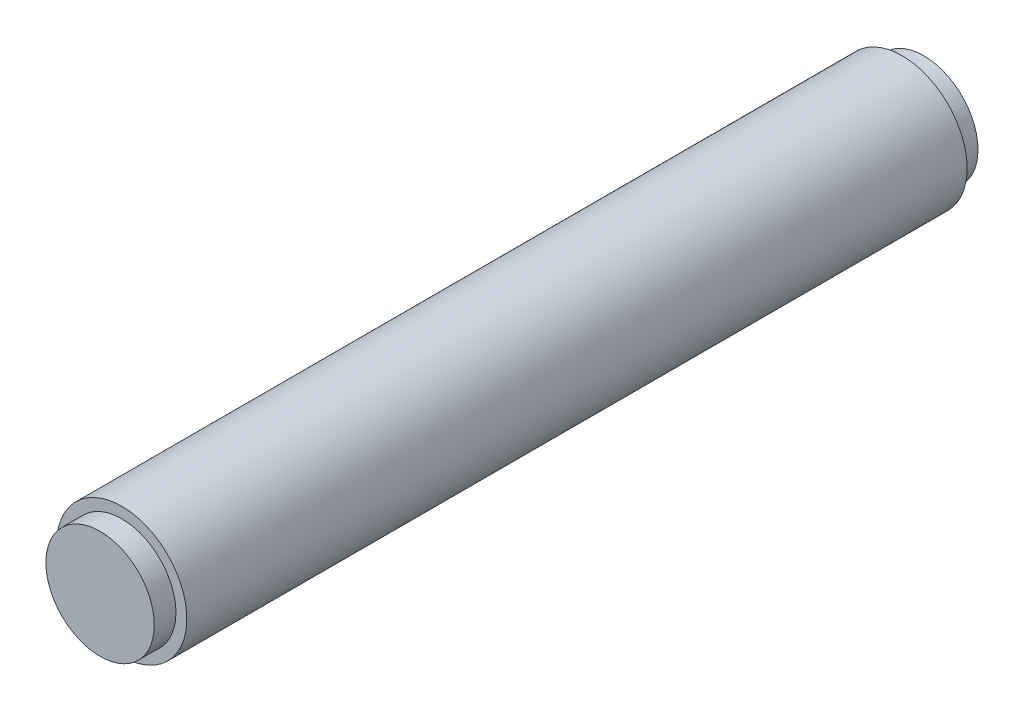
ISO-10303-21;
HEADER;
FILE_DESCRIPTION(('STEP AP214'),'2;1');
FILE_NAME('part.step','',(''),(''),'','','');
FILE_SCHEMA(('AUTOMOTIVE_DESIGN { 1 0 10303 214 1 1 1 1 }'));
ENDSEC;
DATA;
#1=APPLICATION_CONTEXT('core data for automotive mechanical design processes');
#2=APPLICATION_PROTOCOL_DEFINITION('international standard','automotive_design',2000,#1);
#3=PRODUCT_CONTEXT('',#1,'mechanical');
#4=PRODUCT('Part','Part','',(#3));
#5=PRODUCT_RELATED_PRODUCT_CATEGORY('part','',(#4));
#6=PRODUCT_DEFINITION_FORMATION('','',#4);
#7=PRODUCT_DEFINITION_CONTEXT('part definition',#1,'design');
#8=PRODUCT_DEFINITION('design','',#6,#7);
#9=PRODUCT_DEFINITION_SHAPE('','',#8);
#10=(LENGTH_UNIT() NAMED_UNIT(*) SI_UNIT(.MILLI.,.METRE.));
#11=(NAMED_UNIT(*) PLANE_ANGLE_UNIT() SI_UNIT($,.RADIAN.));
#12=(NAMED_UNIT(*) SI_UNIT($,.STERADIAN.) SOLID_ANGLE_UNIT());
#13=UNCERTAINTY_MEASURE_WITH_UNIT(LENGTH_MEASURE(1.E-05),#10,'distance_accuracy_value','');
#14=(GEOMETRIC_REPRESENTATION_CONTEXT(3) GLOBAL_UNCERTAINTY_ASSIGNED_CONTEXT((#13)) GLOBAL_UNIT_ASSIGNED_CONTEXT((#10,
#11,#12)) REPRESENTATION_CONTEXT('',''));
#15=CARTESIAN_POINT('',(0.,0.,0.));
#16=DIRECTION('',(0.,0.,1.));
#17=DIRECTION('',(1.,0.,0.));
#18=AXIS2_PLACEMENT_3D('',#15,#16,#17);
#19=CARTESIAN_POINT('',(-60.8091627752034,26.7674924299176,0.));
#20=DIRECTION('',(0.,0.,1.));
#21=DIRECTION('',(1.,0.,0.));
#22=AXIS2_PLACEMENT_3D('',#19,#20,#21);
#23=PLANE('',#22);
#24=CARTESIAN_POINT('',(-60.8091627752034,26.7674924299176,0.));
#25=DIRECTION('',(0.,0.,1.));
#26=DIRECTION('',(1.,0.,0.));
#27=AXIS2_PLACEMENT_3D('',#24,#25,#26);
#28=CIRCLE('',#27,30.);
#29=CARTESIAN_POINT('',(-90.8091627752034,26.7674924299176,0.));
#30=VERTEX_POINT('',#29);
#31=EDGE_CURVE('E44',#30,#30,#28,.T.);
#32=ORIENTED_EDGE('',*,*,#31,.F.);
#33=EDGE_LOOP('',(#32));
#34=FACE_BOUND('',#33,.T.);
#35=CARTESIAN_POINT('',(-60.8091627752034,26.7674924299176,0.));
#36=DIRECTION('',(0.,0.,1.));
#37=DIRECTION('',(1.,0.,0.));
#38=AXIS2_PLACEMENT_3D('',#35,#36,#37);
#39=CIRCLE('',#38,25.);
#40=CARTESIAN_POINT('',(-35.8091627752034,26.7674924299176,0.));
#41=VERTEX_POINT('',#40);
#42=EDGE_CURVE('E10',#41,#41,#39,.F.);
#43=ORIENTED_EDGE('',*,*,#42,.F.);
#44=EDGE_LOOP('',(#43));
#45=FACE_BOUND('',#44,.T.);
#46=ADVANCED_FACE('F33',(#34,#45),#23,.F.);
#47=CARTESIAN_POINT('',(-60.8091627752034,26.7674924299176,360.));
#48=DIRECTION('',(0.,0.,1.));
#49=DIRECTION('',(1.,0.,0.));
#50=AXIS2_PLACEMENT_3D('',#47,#48,#49);
#51=PLANE('',#50);
#52=CARTESIAN_POINT('',(-60.8091627752034,26.7674924299176,360.));
#53=DIRECTION('',(0.,0.,1.));
#54=DIRECTION('',(1.,0.,0.));
#55=AXIS2_PLACEMENT_3D('',#52,#53,#54);
#56=CIRCLE('',#55,30.);
#57=CARTESIAN_POINT('',(-90.8091627752034,26.7674924299176,360.));
#58=VERTEX_POINT('',#57);
#59=EDGE_CURVE('E40',#58,#58,#56,.T.);
#60=ORIENTED_EDGE('',*,*,#59,.T.);
#61=EDGE_LOOP('',(#60));
#62=FACE_BOUND('',#61,.T.);
#63=CARTESIAN_POINT('',(-60.8091627752034,26.7674924299176,360.));
#64=DIRECTION('',(0.,0.,1.));
#65=DIRECTION('',(1.,0.,0.));
#66=AXIS2_PLACEMENT_3D('',#63,#64,#65);
#67=CIRCLE('',#66,25.);
#68=CARTESIAN_POINT('',(-35.8091627752034,26.7674924299176,360.));
#69=VERTEX_POINT('',#68);
#70=EDGE_CURVE('E51',#69,#69,#67,.T.);
#71=ORIENTED_EDGE('',*,*,#70,.F.);
#72=EDGE_LOOP('',(#71));
#73=FACE_BOUND('',#72,.T.);
#74=ADVANCED_FACE('F75',(#62,#73),#51,.T.);
#75=CARTESIAN_POINT('',(-60.8091627752034,26.7674924299176,360.));
#76=DIRECTION('',(0.,0.,-1.));
#77=DIRECTION('',(-1.,0.,0.));
#78=AXIS2_PLACEMENT_3D('',#75,#76,#77);
#79=CYLINDRICAL_SURFACE('',#78,30.);
#80=CARTESIAN_POINT('',(-90.8091627752034,26.7674924299176,360.));
#81=CARTESIAN_POINT('',(-90.8091627752034,26.7674924299176,356.25));
#82=CARTESIAN_POINT('',(-90.8091627752034,26.7674924299176,352.5));
#83=CARTESIAN_POINT('',(-90.8091627752034,26.7674924299176,345.));
#84=CARTESIAN_POINT('',(-90.8091627752034,26.7674924299176,341.25));
#85=CARTESIAN_POINT('',(-90.8091627752034,26.7674924299176,333.75));
#86=CARTESIAN_POINT('',(-90.8091627752034,26.7674924299176,330.));
#87=CARTESIAN_POINT('',(-90.8091627752034,26.7674924299176,322.5));
#88=CARTESIAN_POINT('',(-90.8091627752034,26.7674924299176,318.75));
#89=CARTESIAN_POINT('',(-90.8091627752034,26.7674924299176,311.25));
#90=CARTESIAN_POINT('',(-90.8091627752034,26.7674924299176,307.5));
#91=CARTESIAN_POINT('',(-90.8091627752034,26.7674924299176,300.));
#92=CARTESIAN_POINT('',(-90.8091627752034,26.7674924299176,296.25));
#93=CARTESIAN_POINT('',(-90.8091627752034,26.7674924299176,288.75));
#94=CARTESIAN_POINT('',(-90.8091627752034,26.7674924299176,285.));
#95=CARTESIAN_POINT('',(-90.8091627752034,26.7674924299176,277.5));
#96=CARTESIAN_POINT('',(-90.8091627752034,26.7674924299176,273.75));
#97=CARTESIAN_POINT('',(-90.8091627752034,26.7674924299176,266.25));
#98=CARTESIAN_POINT('',(-90.8091627752034,26.7674924299176,262.5));
#99=CARTESIAN_POINT('',(-90.8091627752034,26.7674924299176,255.));
#100=CARTESIAN_POINT('',(-90.8091627752034,26.7674924299176,251.25));
#101=CARTESIAN_POINT('',(-90.8091627752034,26.7674924299176,243.75));
#102=CARTESIAN_POINT('',(-90.8091627752034,26.7674924299176,240.));
#103=CARTESIAN_POINT('',(-90.8091627752034,26.7674924299176,232.5));
#104=CARTESIAN_POINT('',(-90.8091627752034,26.7674924299176,228.75));
#105=CARTESIAN_POINT('',(-90.8091627752034,26.7674924299176,221.25));
#106=CARTESIAN_POINT('',(-90.8091627752034,26.7674924299176,217.5));
#107=CARTESIAN_POINT('',(-90.8091627752034,26.7674924299176,210.));
#108=CARTESIAN_POINT('',(-90.8091627752034,26.7674924299176,206.25));
#109=CARTESIAN_POINT('',(-90.8091627752034,26.7674924299176,198.75));
#110=CARTESIAN_POINT('',(-90.8091627752034,26.7674924299176,195.));
#111=CARTESIAN_POINT('',(-90.8091627752034,26.7674924299176,187.5));
#112=CARTESIAN_POINT('',(-90.8091627752034,26.7674924299176,183.75));
#113=CARTESIAN_POINT('',(-90.8091627752034,26.7674924299176,176.25));
#114=CARTESIAN_POINT('',(-90.8091627752034,26.7674924299176,172.5));
#115=CARTESIAN_POINT('',(-90.8091627752034,26.7674924299176,165.));
#116=CARTESIAN_POINT('',(-90.8091627752034,26.7674924299176,161.25));
#117=CARTESIAN_POINT('',(-90.8091627752034,26.7674924299176,153.75));
#118=CARTESIAN_POINT('',(-90.8091627752034,26.7674924299176,150.));
#119=CARTESIAN_POINT('',(-90.8091627752034,26.7674924299176,142.5));
#120=CARTESIAN_POINT('',(-90.8091627752034,26.7674924299176,138.75));
#121=CARTESIAN_POINT('',(-90.8091627752034,26.7674924299176,131.25));
#122=CARTESIAN_POINT('',(-90.8091627752034,26.7674924299176,127.5));
#123=CARTESIAN_POINT('',(-90.8091627752034,26.7674924299176,120.));
#124=CARTESIAN_POINT('',(-90.8091627752034,26.7674924299176,116.25));
#125=CARTESIAN_POINT('',(-90.8091627752034,26.7674924299176,108.75));
#126=CARTESIAN_POINT('',(-90.8091627752034,26.7674924299176,105.));
#127=CARTESIAN_POINT('',(-90.8091627752034,26.7674924299176,97.5));
#128=CARTESIAN_POINT('',(-90.8091627752034,26.7674924299176,93.75));
#129=CARTESIAN_POINT('',(-90.8091627752034,26.7674924299176,86.25));
#130=CARTESIAN_POINT('',(-90.8091627752034,26.7674924299176,82.4999999999999));
#131=CARTESIAN_POINT('',(-90.8091627752034,26.7674924299176,74.9999999999999));
#132=CARTESIAN_POINT('',(-90.8091627752034,26.7674924299176,71.2499999999999));
#133=CARTESIAN_POINT('',(-90.8091627752034,26.7674924299176,63.75));
#134=CARTESIAN_POINT('',(-90.8091627752034,26.7674924299176,60.));
#135=CARTESIAN_POINT('',(-90.8091627752034,26.7674924299176,52.5));
#136=CARTESIAN_POINT('',(-90.8091627752034,26.7674924299176,48.7499999999999));
#137=CARTESIAN_POINT('',(-90.8091627752034,26.7674924299176,41.2499999999999));
#138=CARTESIAN_POINT('',(-90.8091627752034,26.7674924299176,37.4999999999999));
#139=CARTESIAN_POINT('',(-90.8091627752034,26.7674924299176,30.));
#140=CARTESIAN_POINT('',(-90.8091627752034,26.7674924299176,26.25));
#141=CARTESIAN_POINT('',(-90.8091627752034,26.7674924299176,18.75));
#142=CARTESIAN_POINT('',(-90.8091627752034,26.7674924299176,14.9999999999999));
#143=CARTESIAN_POINT('',(-90.8091627752034,26.7674924299176,7.49999999999993));
#144=CARTESIAN_POINT('',(-90.8091627752034,26.7674924299176,3.74999999999994));
#145=CARTESIAN_POINT('',(-90.8091627752034,26.7674924299176,0.));
#146=B_SPLINE_CURVE_WITH_KNOTS('',3,(#80,#81,#82,#83,#84,#85,#86,#87,#88,#89,#90,#91,#92,#93,
#94,#95,#96,#97,#98,#99,#100,#101,#102,#103,#104,#105,#106,#107,#108,#109,#110,#111,#112,#113,
#114,#115,#116,#117,#118,#119,#120,#121,#122,#123,#124,#125,#126,#127,#128,#129,#130,#131,#132,
#133,#134,#135,#136,#137,#138,#139,#140,#141,#142,#143,#144,#145),.UNSPECIFIED.,.F.,.F.,(4,2,2,
2,2,2,2,2,2,2,2,2,2,2,2,2,2,2,2,2,2,2,2,2,2,2,2,2,2,2,2,2,4),(0.,11.25,22.5,33.7499999999999,
45.,56.25,67.4999999999999,78.75,90.,101.25,112.5,123.75,135.,146.25,157.5,168.75,180.,191.25,
202.5,213.75,225.,236.25,247.5,258.75,270.,281.25,292.5,303.75,315.,326.25,337.5,348.75,360.),.UNSPECIFIED.);
#147=EDGE_CURVE('BSEAM35',#58,#30,#146,.T.);
#148=ORIENTED_EDGE('',*,*,#59,.F.);
#149=ORIENTED_EDGE('',*,*,#31,.T.);
#150=ORIENTED_EDGE('',*,*,#147,.T.);
#151=ORIENTED_EDGE('',*,*,#147,.F.);
#152=EDGE_LOOP('',(#148,#150,#149,#151));
#153=FACE_BOUND('',#152,.T.);
#154=ADVANCED_FACE('F35',(#153),#79,.T.);
#155=CARTESIAN_POINT('',(-60.8091627752034,26.7674924299176,370.));
#156=DIRECTION('',(0.,0.,-1.));
#157=DIRECTION('',(-1.,0.,0.));
#158=AXIS2_PLACEMENT_3D('',#155,#156,#157);
#159=CYLINDRICAL_SURFACE('',#158,25.);
#160=CARTESIAN_POINT('',(-60.8091627752034,26.7674924299176,370.));
#161=DIRECTION('',(0.,0.,1.));
#162=DIRECTION('',(1.,0.,0.));
#163=AXIS2_PLACEMENT_3D('',#160,#161,#162);
#164=CIRCLE('',#163,25.);
#165=CARTESIAN_POINT('',(-35.8091627752034,26.7674924299176,370.));
#166=VERTEX_POINT('',#165);
#167=EDGE_CURVE('E49',#166,#166,#164,.T.);
#168=ORIENTED_EDGE('',*,*,#167,.F.);
#169=EDGE_LOOP('',(#168));
#170=FACE_BOUND('',#169,.T.);
#171=ORIENTED_EDGE('',*,*,#70,.T.);
#172=EDGE_LOOP('',(#171));
#173=FACE_BOUND('',#172,.T.);
#174=ADVANCED_FACE('F71',(#170,#173),#159,.T.);
#175=CARTESIAN_POINT('',(-60.8091627752034,26.7674924299176,370.));
#176=DIRECTION('',(0.,0.,1.));
#177=DIRECTION('',(1.,0.,0.));
#178=AXIS2_PLACEMENT_3D('',#175,#176,#177);
#179=PLANE('',#178);
#180=ORIENTED_EDGE('',*,*,#167,.T.);
#181=EDGE_LOOP('',(#180));
#182=FACE_BOUND('',#181,.T.);
#183=ADVANCED_FACE('F64',(#182),#179,.T.);
#184=CARTESIAN_POINT('',(-60.8091627752034,26.7674924299176,-10.));
#185=DIRECTION('',(0.,0.,1.));
#186=DIRECTION('',(1.,0.,0.));
#187=AXIS2_PLACEMENT_3D('',#184,#185,#186);
#188=CYLINDRICAL_SURFACE('',#187,25.);
#189=CARTESIAN_POINT('',(-60.8091627752034,26.7674924299176,-10.));
#190=DIRECTION('',(0.,0.,-1.));
#191=DIRECTION('',(-1.,0.,0.));
#192=AXIS2_PLACEMENT_3D('',#189,#190,#191);
#193=CIRCLE('',#192,25.);
#194=CARTESIAN_POINT('',(-85.8091627752034,26.7674924299176,-10.));
#195=VERTEX_POINT('',#194);
#196=EDGE_CURVE('E54',#195,#195,#193,.T.);
#197=ORIENTED_EDGE('',*,*,#196,.F.);
#198=EDGE_LOOP('',(#197));
#199=FACE_BOUND('',#198,.T.);
#200=ORIENTED_EDGE('',*,*,#42,.T.);
#201=EDGE_LOOP('',(#200));
#202=FACE_BOUND('',#201,.T.);
#203=ADVANCED_FACE('F62',(#199,#202),#188,.T.);
#204=CARTESIAN_POINT('',(-60.8091627752034,26.7674924299176,-10.));
#205=DIRECTION('',(0.,0.,-1.));
#206=DIRECTION('',(-1.,0.,0.));
#207=AXIS2_PLACEMENT_3D('',#204,#205,#206);
#208=PLANE('',#207);
#209=ORIENTED_EDGE('',*,*,#196,.T.);
#210=EDGE_LOOP('',(#209));
#211=FACE_BOUND('',#210,.T.);
#212=ADVANCED_FACE('F60',(#211),#208,.T.);
#213=CLOSED_SHELL('',(#46,#74,#154,#174,#183,#203,#212));
#214=MANIFOLD_SOLID_BREP('B2',#213);
#215=ADVANCED_BREP_SHAPE_REPRESENTATION('',(#18,#214),#14);
#216=SHAPE_DEFINITION_REPRESENTATION(#9,#215);
ENDSEC;
END-ISO-10303-21;
